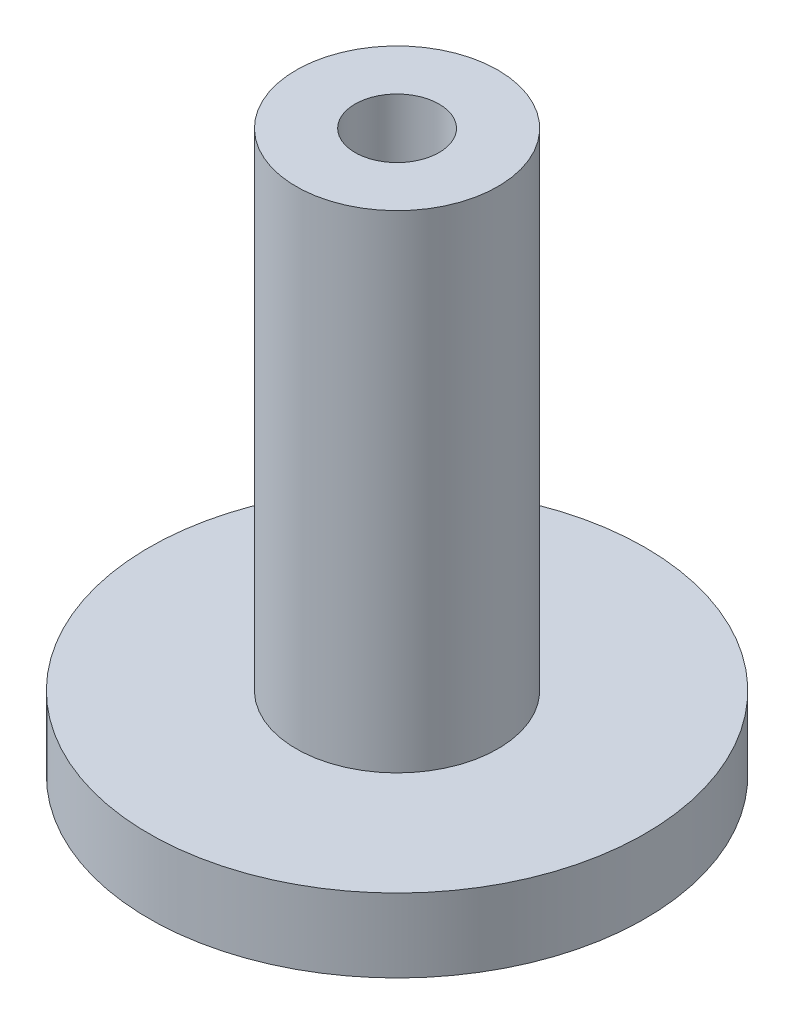
ISO-10303-21;
HEADER;
FILE_DESCRIPTION(('STEP AP214'),'2;1');
FILE_NAME('part.step','',(''),(''),'','','');
FILE_SCHEMA(('AUTOMOTIVE_DESIGN { 1 0 10303 214 1 1 1 1 }'));
ENDSEC;
DATA;
#1=APPLICATION_CONTEXT('core data for automotive mechanical design processes');
#2=APPLICATION_PROTOCOL_DEFINITION('international standard','automotive_design',2000,#1);
#3=PRODUCT_CONTEXT('',#1,'mechanical');
#4=PRODUCT('Part','Part','',(#3));
#5=PRODUCT_RELATED_PRODUCT_CATEGORY('part','',(#4));
#6=PRODUCT_DEFINITION_FORMATION('','',#4);
#7=PRODUCT_DEFINITION_CONTEXT('part definition',#1,'design');
#8=PRODUCT_DEFINITION('design','',#6,#7);
#9=PRODUCT_DEFINITION_SHAPE('','',#8);
#10=(LENGTH_UNIT() NAMED_UNIT(*) SI_UNIT(.MILLI.,.METRE.));
#11=(NAMED_UNIT(*) PLANE_ANGLE_UNIT() SI_UNIT($,.RADIAN.));
#12=(NAMED_UNIT(*) SI_UNIT($,.STERADIAN.) SOLID_ANGLE_UNIT());
#13=UNCERTAINTY_MEASURE_WITH_UNIT(LENGTH_MEASURE(1.E-05),#10,'distance_accuracy_value','');
#14=(GEOMETRIC_REPRESENTATION_CONTEXT(3) GLOBAL_UNCERTAINTY_ASSIGNED_CONTEXT((#13)) GLOBAL_UNIT_ASSIGNED_CONTEXT((#10,
#11,#12)) REPRESENTATION_CONTEXT('',''));
#15=CARTESIAN_POINT('',(0.,0.,0.));
#16=DIRECTION('',(0.,0.,1.));
#17=DIRECTION('',(1.,0.,0.));
#18=AXIS2_PLACEMENT_3D('',#15,#16,#17);
#19=CARTESIAN_POINT('',(-6.743,0.,0.));
#20=DIRECTION('',(0.,1.,0.));
#21=DIRECTION('',(0.,0.,1.));
#22=AXIS2_PLACEMENT_3D('',#19,#20,#21);
#23=PLANE('',#22);
#24=CARTESIAN_POINT('',(0.,0.,0.));
#25=DIRECTION('',(0.,-1.,0.));
#26=DIRECTION('',(0.,0.,-1.));
#27=AXIS2_PLACEMENT_3D('',#24,#25,#26);
#28=CIRCLE('',#27,1.143);
#29=CARTESIAN_POINT('',(0.,0.,-1.143));
#30=VERTEX_POINT('',#29);
#31=EDGE_CURVE('E10',#30,#30,#28,.T.);
#32=ORIENTED_EDGE('',*,*,#31,.F.);
#33=EDGE_LOOP('',(#32));
#34=FACE_BOUND('',#33,.T.);
#35=CARTESIAN_POINT('',(0.,0.,0.));
#36=DIRECTION('',(0.,-1.,0.));
#37=DIRECTION('',(0.,0.,-1.));
#38=AXIS2_PLACEMENT_3D('',#35,#36,#37);
#39=CIRCLE('',#38,6.743);
#40=CARTESIAN_POINT('',(0.,0.,-6.743));
#41=VERTEX_POINT('',#40);
#42=EDGE_CURVE('E55',#41,#41,#39,.T.);
#43=ORIENTED_EDGE('',*,*,#42,.T.);
#44=EDGE_LOOP('',(#43));
#45=FACE_BOUND('',#44,.T.);
#46=ADVANCED_FACE('F33',(#34,#45),#23,.F.);
#47=CARTESIAN_POINT('',(0.,0.,0.));
#48=DIRECTION('',(0.,-1.,0.));
#49=DIRECTION('',(0.,0.,-1.));
#50=AXIS2_PLACEMENT_3D('',#47,#48,#49);
#51=CYLINDRICAL_SURFACE('',#50,1.143);
#52=CARTESIAN_POINT('',(0.,15.24,0.));
#53=DIRECTION('',(0.,-1.,0.));
#54=DIRECTION('',(0.,0.,-1.));
#55=AXIS2_PLACEMENT_3D('',#52,#53,#54);
#56=CIRCLE('',#55,1.143);
#57=CARTESIAN_POINT('',(0.,15.24,-1.143));
#58=VERTEX_POINT('',#57);
#59=EDGE_CURVE('E39',#58,#58,#56,.T.);
#60=ORIENTED_EDGE('',*,*,#59,.F.);
#61=EDGE_LOOP('',(#60));
#62=FACE_BOUND('',#61,.T.);
#63=ORIENTED_EDGE('',*,*,#31,.T.);
#64=EDGE_LOOP('',(#63));
#65=FACE_BOUND('',#64,.T.);
#66=ADVANCED_FACE('F80',(#62,#65),#51,.F.);
#67=CARTESIAN_POINT('',(-1.143,15.24,0.));
#68=DIRECTION('',(0.,-1.,0.));
#69=DIRECTION('',(0.,0.,-1.));
#70=AXIS2_PLACEMENT_3D('',#67,#68,#69);
#71=PLANE('',#70);
#72=CARTESIAN_POINT('',(0.,15.24,0.));
#73=DIRECTION('',(0.,-1.,0.));
#74=DIRECTION('',(0.,0.,-1.));
#75=AXIS2_PLACEMENT_3D('',#72,#73,#74);
#76=CIRCLE('',#75,2.743);
#77=CARTESIAN_POINT('',(0.,15.24,-2.743));
#78=VERTEX_POINT('',#77);
#79=EDGE_CURVE('E43',#78,#78,#76,.T.);
#80=ORIENTED_EDGE('',*,*,#79,.F.);
#81=EDGE_LOOP('',(#80));
#82=FACE_BOUND('',#81,.T.);
#83=ORIENTED_EDGE('',*,*,#59,.T.);
#84=EDGE_LOOP('',(#83));
#85=FACE_BOUND('',#84,.T.);
#86=ADVANCED_FACE('F75',(#82,#85),#71,.F.);
#87=CARTESIAN_POINT('',(0.,0.,0.));
#88=DIRECTION('',(0.,-1.,0.));
#89=DIRECTION('',(0.,0.,-1.));
#90=AXIS2_PLACEMENT_3D('',#87,#88,#89);
#91=CYLINDRICAL_SURFACE('',#90,2.743);
#92=CARTESIAN_POINT('',(0.,2.,0.));
#93=DIRECTION('',(0.,-1.,0.));
#94=DIRECTION('',(0.,0.,-1.));
#95=AXIS2_PLACEMENT_3D('',#92,#93,#94);
#96=CIRCLE('',#95,2.743);
#97=CARTESIAN_POINT('',(0.,2.,-2.743));
#98=VERTEX_POINT('',#97);
#99=EDGE_CURVE('E47',#98,#98,#96,.T.);
#100=ORIENTED_EDGE('',*,*,#99,.F.);
#101=EDGE_LOOP('',(#100));
#102=FACE_BOUND('',#101,.T.);
#103=ORIENTED_EDGE('',*,*,#79,.T.);
#104=EDGE_LOOP('',(#103));
#105=FACE_BOUND('',#104,.T.);
#106=ADVANCED_FACE('F69',(#102,#105),#91,.T.);
#107=CARTESIAN_POINT('',(-2.743,2.,0.));
#108=DIRECTION('',(0.,-1.,0.));
#109=DIRECTION('',(0.,0.,-1.));
#110=AXIS2_PLACEMENT_3D('',#107,#108,#109);
#111=PLANE('',#110);
#112=CARTESIAN_POINT('',(0.,2.,0.));
#113=DIRECTION('',(0.,-1.,0.));
#114=DIRECTION('',(0.,0.,-1.));
#115=AXIS2_PLACEMENT_3D('',#112,#113,#114);
#116=CIRCLE('',#115,6.743);
#117=CARTESIAN_POINT('',(0.,2.,-6.743));
#118=VERTEX_POINT('',#117);
#119=EDGE_CURVE('E52',#118,#118,#116,.T.);
#120=ORIENTED_EDGE('',*,*,#119,.F.);
#121=EDGE_LOOP('',(#120));
#122=FACE_BOUND('',#121,.T.);
#123=ORIENTED_EDGE('',*,*,#99,.T.);
#124=EDGE_LOOP('',(#123));
#125=FACE_BOUND('',#124,.T.);
#126=ADVANCED_FACE('F63',(#122,#125),#111,.F.);
#127=CARTESIAN_POINT('',(0.,0.,0.));
#128=DIRECTION('',(0.,-1.,0.));
#129=DIRECTION('',(0.,0.,-1.));
#130=AXIS2_PLACEMENT_3D('',#127,#128,#129);
#131=CYLINDRICAL_SURFACE('',#130,6.743);
#132=ORIENTED_EDGE('',*,*,#42,.F.);
#133=EDGE_LOOP('',(#132));
#134=FACE_BOUND('',#133,.T.);
#135=ORIENTED_EDGE('',*,*,#119,.T.);
#136=EDGE_LOOP('',(#135));
#137=FACE_BOUND('',#136,.T.);
#138=ADVANCED_FACE('F60',(#134,#137),#131,.T.);
#139=CLOSED_SHELL('',(#46,#66,#86,#106,#126,#138));
#140=MANIFOLD_SOLID_BREP('B2',#139);
#141=ADVANCED_BREP_SHAPE_REPRESENTATION('',(#18,#140),#14);
#142=SHAPE_DEFINITION_REPRESENTATION(#9,#141);
ENDSEC;
END-ISO-10303-21;
